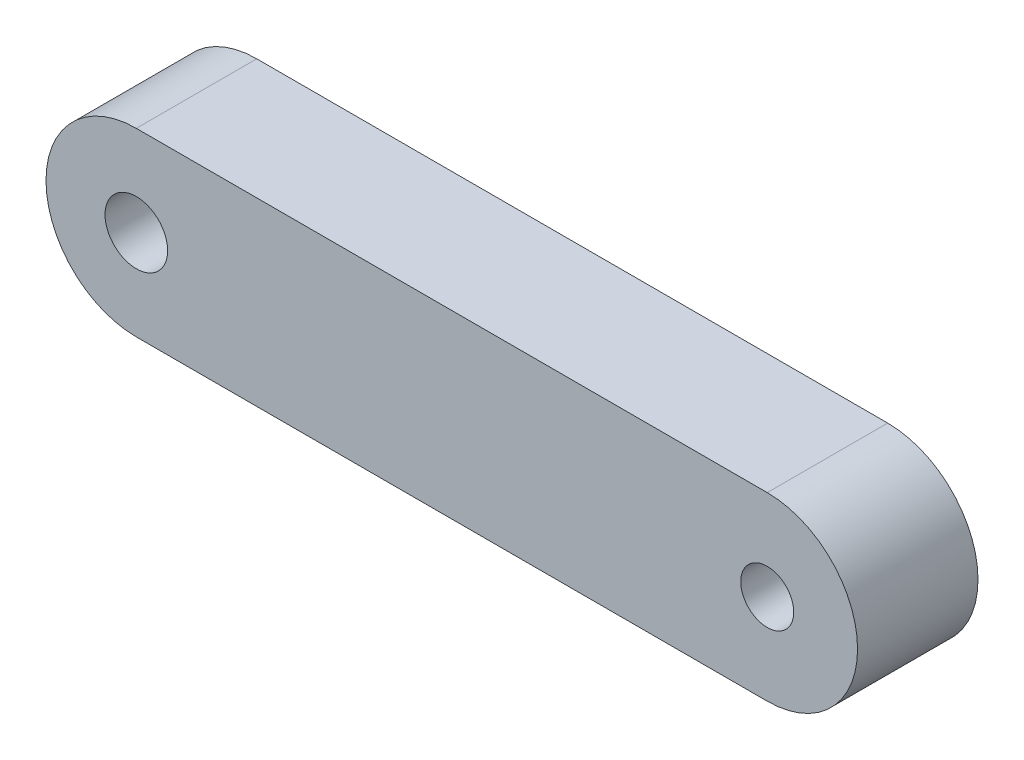
ISO-10303-21;
HEADER;
FILE_DESCRIPTION(('STEP AP214'),'2;1');
FILE_NAME('part.step','',(''),(''),'','','');
FILE_SCHEMA(('AUTOMOTIVE_DESIGN { 1 0 10303 214 1 1 1 1 }'));
ENDSEC;
DATA;
#1=APPLICATION_CONTEXT('core data for automotive mechanical design processes');
#2=APPLICATION_PROTOCOL_DEFINITION('international standard','automotive_design',2000,#1);
#3=PRODUCT_CONTEXT('',#1,'mechanical');
#4=PRODUCT('Part','Part','',(#3));
#5=PRODUCT_RELATED_PRODUCT_CATEGORY('part','',(#4));
#6=PRODUCT_DEFINITION_FORMATION('','',#4);
#7=PRODUCT_DEFINITION_CONTEXT('part definition',#1,'design');
#8=PRODUCT_DEFINITION('design','',#6,#7);
#9=PRODUCT_DEFINITION_SHAPE('','',#8);
#10=(LENGTH_UNIT() NAMED_UNIT(*) SI_UNIT(.MILLI.,.METRE.));
#11=(NAMED_UNIT(*) PLANE_ANGLE_UNIT() SI_UNIT($,.RADIAN.));
#12=(NAMED_UNIT(*) SI_UNIT($,.STERADIAN.) SOLID_ANGLE_UNIT());
#13=UNCERTAINTY_MEASURE_WITH_UNIT(LENGTH_MEASURE(1.E-05),#10,'distance_accuracy_value','');
#14=(GEOMETRIC_REPRESENTATION_CONTEXT(3) GLOBAL_UNCERTAINTY_ASSIGNED_CONTEXT((#13)) GLOBAL_UNIT_ASSIGNED_CONTEXT((#10,
#11,#12)) REPRESENTATION_CONTEXT('',''));
#15=CARTESIAN_POINT('',(0.,0.,0.));
#16=DIRECTION('',(0.,0.,1.));
#17=DIRECTION('',(1.,0.,0.));
#18=AXIS2_PLACEMENT_3D('',#15,#16,#17);
#19=CARTESIAN_POINT('',(-16.632351927,0.,6.35));
#20=DIRECTION('',(0.,0.,-1.));
#21=DIRECTION('',(-1.,0.,0.));
#22=AXIS2_PLACEMENT_3D('',#19,#20,#21);
#23=CYLINDRICAL_SURFACE('',#22,1.65);
#24=CARTESIAN_POINT('',(-16.632351927,0.,6.35));
#25=DIRECTION('',(0.,0.,1.));
#26=DIRECTION('',(1.,0.,0.));
#27=AXIS2_PLACEMENT_3D('',#24,#25,#26);
#28=CIRCLE('',#27,1.65);
#29=CARTESIAN_POINT('',(-14.982351927,0.,6.35));
#30=VERTEX_POINT('',#29);
#31=EDGE_CURVE('E120',#30,#30,#28,.T.);
#32=ORIENTED_EDGE('',*,*,#31,.T.);
#33=EDGE_LOOP('',(#32));
#34=FACE_BOUND('',#33,.T.);
#35=CARTESIAN_POINT('',(-16.632351927,0.,3.75000012));
#36=DIRECTION('',(0.,0.,-1.));
#37=DIRECTION('',(-1.,0.,0.));
#38=AXIS2_PLACEMENT_3D('',#35,#36,#37);
#39=CIRCLE('',#38,1.65);
#40=CARTESIAN_POINT('',(-18.282351927,0.,3.75000012));
#41=VERTEX_POINT('',#40);
#42=EDGE_CURVE('E39',#41,#41,#39,.T.);
#43=ORIENTED_EDGE('',*,*,#42,.T.);
#44=EDGE_LOOP('',(#43));
#45=FACE_BOUND('',#44,.T.);
#46=ADVANCED_FACE('F35',(#34,#45),#23,.F.);
#47=CARTESIAN_POINT('',(-16.632351927,0.,6.35));
#48=DIRECTION('',(0.,0.,1.));
#49=DIRECTION('',(1.,0.,0.));
#50=AXIS2_PLACEMENT_3D('',#47,#48,#49);
#51=PLANE('',#50);
#52=CARTESIAN_POINT('',(16.632351927,0.,6.35));
#53=DIRECTION('',(0.,0.,1.));
#54=DIRECTION('',(1.,0.,0.));
#55=AXIS2_PLACEMENT_3D('',#52,#53,#54);
#56=CIRCLE('',#55,1.3969);
#57=CARTESIAN_POINT('',(18.029251927,0.,6.35));
#58=VERTEX_POINT('',#57);
#59=EDGE_CURVE('E105',#58,#58,#56,.T.);
#60=ORIENTED_EDGE('',*,*,#59,.F.);
#61=EDGE_LOOP('',(#60));
#62=FACE_BOUND('',#61,.T.);
#63=CARTESIAN_POINT('',(-16.632351927,0.,6.35));
#64=DIRECTION('',(0.,0.,1.));
#65=DIRECTION('',(1.,0.,0.));
#66=AXIS2_PLACEMENT_3D('',#63,#64,#65);
#67=CIRCLE('',#66,4.7625);
#68=CARTESIAN_POINT('',(-16.632351927,4.7625,6.35));
#69=VERTEX_POINT('',#68);
#70=CARTESIAN_POINT('',(-16.632351927,-4.7625,6.35));
#71=VERTEX_POINT('',#70);
#72=EDGE_CURVE('E89',#69,#71,#67,.T.);
#73=ORIENTED_EDGE('',*,*,#72,.T.);
#74=DIRECTION('',(1.,0.,0.));
#75=VECTOR('',#74,1.);
#76=CARTESIAN_POINT('',(-16.632351927,-4.7625,6.35));
#77=LINE('',#76,#75);
#78=CARTESIAN_POINT('',(16.632351927,-4.7625,6.35));
#79=VERTEX_POINT('',#78);
#80=EDGE_CURVE('E83',#71,#79,#77,.T.);
#81=ORIENTED_EDGE('',*,*,#80,.T.);
#82=CARTESIAN_POINT('',(16.632351927,0.,6.35));
#83=DIRECTION('',(0.,0.,1.));
#84=DIRECTION('',(1.,0.,0.));
#85=AXIS2_PLACEMENT_3D('',#82,#83,#84);
#86=CIRCLE('',#85,4.7625);
#87=CARTESIAN_POINT('',(16.632351927,4.7625,6.35));
#88=VERTEX_POINT('',#87);
#89=EDGE_CURVE('E87',#79,#88,#86,.T.);
#90=ORIENTED_EDGE('',*,*,#89,.T.);
#91=DIRECTION('',(-1.,0.,0.));
#92=VECTOR('',#91,1.);
#93=CARTESIAN_POINT('',(-16.632351927,4.7625,6.35));
#94=LINE('',#93,#92);
#95=EDGE_CURVE('E53',#88,#69,#94,.T.);
#96=ORIENTED_EDGE('',*,*,#95,.T.);
#97=EDGE_LOOP('',(#73,#81,#90,#96));
#98=FACE_BOUND('',#97,.T.);
#99=ORIENTED_EDGE('',*,*,#31,.F.);
#100=EDGE_LOOP('',(#99));
#101=FACE_BOUND('',#100,.T.);
#102=ADVANCED_FACE('F84',(#62,#98,#101),#51,.T.);
#103=CARTESIAN_POINT('',(-16.632351927,0.,0.));
#104=DIRECTION('',(0.,0.,1.));
#105=DIRECTION('',(1.,0.,0.));
#106=AXIS2_PLACEMENT_3D('',#103,#104,#105);
#107=PLANE('',#106);
#108=CARTESIAN_POINT('',(-16.632351927,0.,0.));
#109=DIRECTION('',(0.,0.,-1.));
#110=DIRECTION('',(-1.,0.,0.));
#111=AXIS2_PLACEMENT_3D('',#108,#109,#110);
#112=CIRCLE('',#111,3.1);
#113=CARTESIAN_POINT('',(-19.732351927,0.,0.));
#114=VERTEX_POINT('',#113);
#115=EDGE_CURVE('E125',#114,#114,#112,.T.);
#116=ORIENTED_EDGE('',*,*,#115,.F.);
#117=EDGE_LOOP('',(#116));
#118=FACE_BOUND('',#117,.T.);
#119=CARTESIAN_POINT('',(-16.632351927,0.,0.));
#120=DIRECTION('',(0.,0.,1.));
#121=DIRECTION('',(1.,0.,0.));
#122=AXIS2_PLACEMENT_3D('',#119,#120,#121);
#123=CIRCLE('',#122,4.7625);
#124=CARTESIAN_POINT('',(-16.632351927,4.7625,0.));
#125=VERTEX_POINT('',#124);
#126=CARTESIAN_POINT('',(-16.632351927,-4.7625,0.));
#127=VERTEX_POINT('',#126);
#128=EDGE_CURVE('E102',#125,#127,#123,.T.);
#129=ORIENTED_EDGE('',*,*,#128,.F.);
#130=DIRECTION('',(-1.,0.,0.));
#131=VECTOR('',#130,1.);
#132=CARTESIAN_POINT('',(-16.632351927,4.7625,0.));
#133=LINE('',#132,#131);
#134=CARTESIAN_POINT('',(16.632351927,4.7625,0.));
#135=VERTEX_POINT('',#134);
#136=EDGE_CURVE('E76',#135,#125,#133,.T.);
#137=ORIENTED_EDGE('',*,*,#136,.F.);
#138=CARTESIAN_POINT('',(16.632351927,0.,0.));
#139=DIRECTION('',(0.,0.,1.));
#140=DIRECTION('',(1.,0.,0.));
#141=AXIS2_PLACEMENT_3D('',#138,#139,#140);
#142=CIRCLE('',#141,4.7625);
#143=CARTESIAN_POINT('',(16.632351927,-4.7625,0.));
#144=VERTEX_POINT('',#143);
#145=EDGE_CURVE('E70',#144,#135,#142,.T.);
#146=ORIENTED_EDGE('',*,*,#145,.F.);
#147=DIRECTION('',(1.,0.,0.));
#148=VECTOR('',#147,1.);
#149=CARTESIAN_POINT('',(-16.632351927,-4.7625,0.));
#150=LINE('',#149,#148);
#151=EDGE_CURVE('E93',#127,#144,#150,.T.);
#152=ORIENTED_EDGE('',*,*,#151,.F.);
#153=EDGE_LOOP('',(#129,#137,#146,#152));
#154=FACE_BOUND('',#153,.T.);
#155=CARTESIAN_POINT('',(16.632351927,0.,0.));
#156=DIRECTION('',(0.,0.,1.));
#157=DIRECTION('',(1.,0.,0.));
#158=AXIS2_PLACEMENT_3D('',#155,#156,#157);
#159=CIRCLE('',#158,1.3969);
#160=CARTESIAN_POINT('',(18.029251927,0.,0.));
#161=VERTEX_POINT('',#160);
#162=EDGE_CURVE('E117',#161,#161,#159,.T.);
#163=ORIENTED_EDGE('',*,*,#162,.T.);
#164=EDGE_LOOP('',(#163));
#165=FACE_BOUND('',#164,.T.);
#166=ADVANCED_FACE('F113',(#118,#154,#165),#107,.F.);
#167=CARTESIAN_POINT('',(-16.632351927,0.,6.35));
#168=DIRECTION('',(0.,0.,-1.));
#169=DIRECTION('',(-1.,0.,0.));
#170=AXIS2_PLACEMENT_3D('',#167,#168,#169);
#171=CYLINDRICAL_SURFACE('',#170,4.7625);
#172=ORIENTED_EDGE('',*,*,#128,.T.);
#173=DIRECTION('',(0.,0.,-1.));
#174=VECTOR('',#173,1.);
#175=CARTESIAN_POINT('',(-16.632351927,-4.7625,6.35));
#176=LINE('',#175,#174);
#177=EDGE_CURVE('E11',#71,#127,#176,.T.);
#178=ORIENTED_EDGE('',*,*,#177,.F.);
#179=ORIENTED_EDGE('',*,*,#72,.F.);
#180=DIRECTION('',(0.,0.,-1.));
#181=VECTOR('',#180,1.);
#182=CARTESIAN_POINT('',(-16.632351927,4.7625,6.35));
#183=LINE('',#182,#181);
#184=EDGE_CURVE('E98',#69,#125,#183,.T.);
#185=ORIENTED_EDGE('',*,*,#184,.T.);
#186=EDGE_LOOP('',(#172,#178,#179,#185));
#187=FACE_BOUND('',#186,.T.);
#188=ADVANCED_FACE('F37',(#187),#171,.T.);
#189=CARTESIAN_POINT('',(-16.632351927,-4.7625,6.35));
#190=DIRECTION('',(0.,1.,0.));
#191=DIRECTION('',(0.,0.,1.));
#192=AXIS2_PLACEMENT_3D('',#189,#190,#191);
#193=PLANE('',#192);
#194=ORIENTED_EDGE('',*,*,#151,.T.);
#195=DIRECTION('',(0.,0.,-1.));
#196=VECTOR('',#195,1.);
#197=CARTESIAN_POINT('',(16.632351927,-4.7625,6.35));
#198=LINE('',#197,#196);
#199=EDGE_CURVE('E45',#79,#144,#198,.T.);
#200=ORIENTED_EDGE('',*,*,#199,.F.);
#201=ORIENTED_EDGE('',*,*,#80,.F.);
#202=ORIENTED_EDGE('',*,*,#177,.T.);
#203=EDGE_LOOP('',(#194,#200,#201,#202));
#204=FACE_BOUND('',#203,.T.);
#205=ADVANCED_FACE('F92',(#204),#193,.F.);
#206=CARTESIAN_POINT('',(16.632351927,0.,6.35));
#207=DIRECTION('',(0.,0.,-1.));
#208=DIRECTION('',(-1.,0.,0.));
#209=AXIS2_PLACEMENT_3D('',#206,#207,#208);
#210=CYLINDRICAL_SURFACE('',#209,4.7625);
#211=ORIENTED_EDGE('',*,*,#145,.T.);
#212=DIRECTION('',(0.,0.,-1.));
#213=VECTOR('',#212,1.);
#214=CARTESIAN_POINT('',(16.632351927,4.7625,6.35));
#215=LINE('',#214,#213);
#216=EDGE_CURVE('E94',#88,#135,#215,.T.);
#217=ORIENTED_EDGE('',*,*,#216,.F.);
#218=ORIENTED_EDGE('',*,*,#89,.F.);
#219=ORIENTED_EDGE('',*,*,#199,.T.);
#220=EDGE_LOOP('',(#211,#217,#218,#219));
#221=FACE_BOUND('',#220,.T.);
#222=ADVANCED_FACE('F96',(#221),#210,.T.);
#223=CARTESIAN_POINT('',(-16.632351927,4.7625,6.35));
#224=DIRECTION('',(0.,-1.,0.));
#225=DIRECTION('',(0.,0.,-1.));
#226=AXIS2_PLACEMENT_3D('',#223,#224,#225);
#227=PLANE('',#226);
#228=ORIENTED_EDGE('',*,*,#136,.T.);
#229=ORIENTED_EDGE('',*,*,#184,.F.);
#230=ORIENTED_EDGE('',*,*,#95,.F.);
#231=ORIENTED_EDGE('',*,*,#216,.T.);
#232=EDGE_LOOP('',(#228,#229,#230,#231));
#233=FACE_BOUND('',#232,.T.);
#234=ADVANCED_FACE('F110',(#233),#227,.F.);
#235=CARTESIAN_POINT('',(16.632351927,0.,6.35));
#236=DIRECTION('',(0.,0.,-1.));
#237=DIRECTION('',(-1.,0.,0.));
#238=AXIS2_PLACEMENT_3D('',#235,#236,#237);
#239=CYLINDRICAL_SURFACE('',#238,1.3969);
#240=ORIENTED_EDGE('',*,*,#59,.T.);
#241=EDGE_LOOP('',(#240));
#242=FACE_BOUND('',#241,.T.);
#243=ORIENTED_EDGE('',*,*,#162,.F.);
#244=EDGE_LOOP('',(#243));
#245=FACE_BOUND('',#244,.T.);
#246=ADVANCED_FACE('F143',(#242,#245),#239,.F.);
#247=CARTESIAN_POINT('',(-16.632351927,0.,3.75000012));
#248=DIRECTION('',(0.,0.,-1.));
#249=DIRECTION('',(-1.,0.,0.));
#250=AXIS2_PLACEMENT_3D('',#247,#248,#249);
#251=CYLINDRICAL_SURFACE('',#250,3.1);
#252=CARTESIAN_POINT('',(-16.632351927,0.,3.75000012));
#253=DIRECTION('',(0.,0.,-1.));
#254=DIRECTION('',(-1.,0.,0.));
#255=AXIS2_PLACEMENT_3D('',#252,#253,#254);
#256=CIRCLE('',#255,3.1);
#257=CARTESIAN_POINT('',(-19.732351927,0.,3.75000012));
#258=VERTEX_POINT('',#257);
#259=EDGE_CURVE('E128',#258,#258,#256,.T.);
#260=ORIENTED_EDGE('',*,*,#259,.F.);
#261=EDGE_LOOP('',(#260));
#262=FACE_BOUND('',#261,.T.);
#263=ORIENTED_EDGE('',*,*,#115,.T.);
#264=EDGE_LOOP('',(#263));
#265=FACE_BOUND('',#264,.T.);
#266=ADVANCED_FACE('F138',(#262,#265),#251,.F.);
#267=CARTESIAN_POINT('',(-16.632351927,0.,3.75000012));
#268=DIRECTION('',(0.,0.,-1.));
#269=DIRECTION('',(-1.,0.,0.));
#270=AXIS2_PLACEMENT_3D('',#267,#268,#269);
#271=PLANE('',#270);
#272=ORIENTED_EDGE('',*,*,#42,.F.);
#273=EDGE_LOOP('',(#272));
#274=FACE_BOUND('',#273,.T.);
#275=ORIENTED_EDGE('',*,*,#259,.T.);
#276=EDGE_LOOP('',(#275));
#277=FACE_BOUND('',#276,.T.);
#278=ADVANCED_FACE('F136',(#274,#277),#271,.T.);
#279=CLOSED_SHELL('',(#46,#102,#166,#188,#205,#222,#234,#246,#266,#278));
#280=MANIFOLD_SOLID_BREP('B2',#279);
#281=ADVANCED_BREP_SHAPE_REPRESENTATION('',(#18,#280),#14);
#282=SHAPE_DEFINITION_REPRESENTATION(#9,#281);
ENDSEC;
END-ISO-10303-21;
